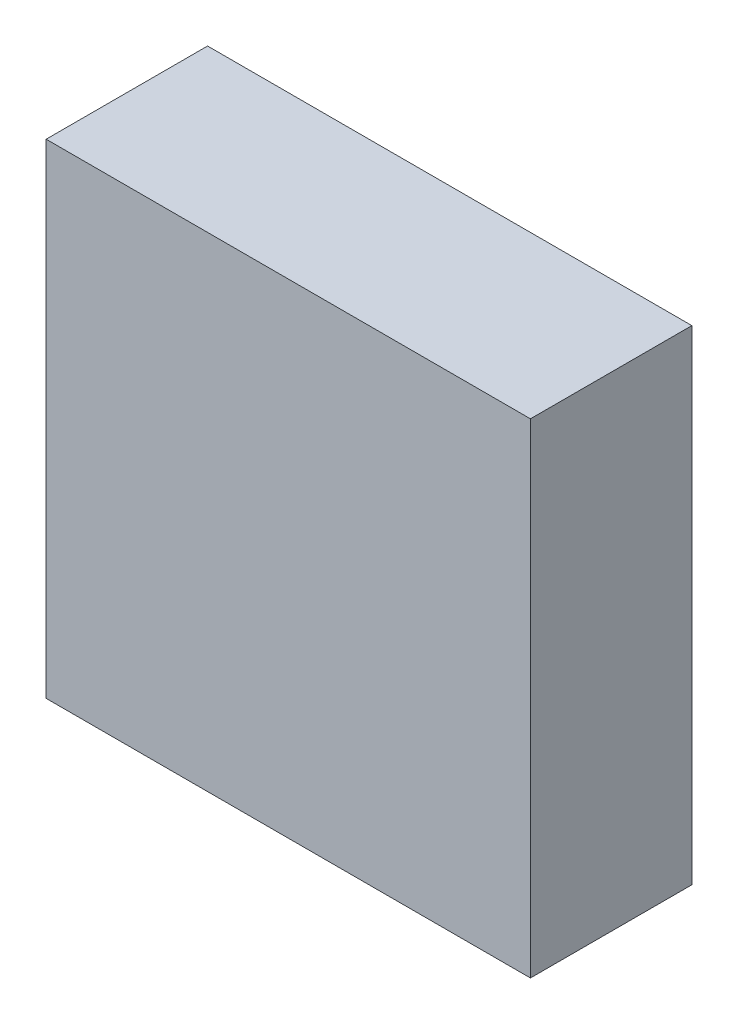
ISO-10303-21;
HEADER;
FILE_DESCRIPTION(('STEP AP214'),'2;1');
FILE_NAME('part.step','',(''),(''),'','','');
FILE_SCHEMA(('AUTOMOTIVE_DESIGN { 1 0 10303 214 1 1 1 1 }'));
ENDSEC;
DATA;
#1=APPLICATION_CONTEXT('core data for automotive mechanical design processes');
#2=APPLICATION_PROTOCOL_DEFINITION('international standard','automotive_design',2000,#1);
#3=PRODUCT_CONTEXT('',#1,'mechanical');
#4=PRODUCT('Part','Part','',(#3));
#5=PRODUCT_RELATED_PRODUCT_CATEGORY('part','',(#4));
#6=PRODUCT_DEFINITION_FORMATION('','',#4);
#7=PRODUCT_DEFINITION_CONTEXT('part definition',#1,'design');
#8=PRODUCT_DEFINITION('design','',#6,#7);
#9=PRODUCT_DEFINITION_SHAPE('','',#8);
#10=(LENGTH_UNIT() NAMED_UNIT(*) SI_UNIT(.MILLI.,.METRE.));
#11=(NAMED_UNIT(*) PLANE_ANGLE_UNIT() SI_UNIT($,.RADIAN.));
#12=(NAMED_UNIT(*) SI_UNIT($,.STERADIAN.) SOLID_ANGLE_UNIT());
#13=UNCERTAINTY_MEASURE_WITH_UNIT(LENGTH_MEASURE(1.E-05),#10,'distance_accuracy_value','');
#14=(GEOMETRIC_REPRESENTATION_CONTEXT(3) GLOBAL_UNCERTAINTY_ASSIGNED_CONTEXT((#13)) GLOBAL_UNIT_ASSIGNED_CONTEXT((#10,
#11,#12)) REPRESENTATION_CONTEXT('',''));
#15=CARTESIAN_POINT('',(0.,0.,0.));
#16=DIRECTION('',(0.,0.,1.));
#17=DIRECTION('',(1.,0.,0.));
#18=AXIS2_PLACEMENT_3D('',#15,#16,#17);
#19=CARTESIAN_POINT('',(30.,15.,5.));
#20=DIRECTION('',(0.,0.,-1.));
#21=DIRECTION('',(-1.,0.,0.));
#22=AXIS2_PLACEMENT_3D('',#19,#20,#21);
#23=PLANE('',#22);
#24=DIRECTION('',(0.,-1.,0.));
#25=VECTOR('',#24,1.);
#26=CARTESIAN_POINT('',(0.,15.,5.));
#27=LINE('',#26,#25);
#28=CARTESIAN_POINT('',(0.,15.,5.));
#29=VERTEX_POINT('',#28);
#30=CARTESIAN_POINT('',(0.,-15.,5.));
#31=VERTEX_POINT('',#30);
#32=EDGE_CURVE('E101',#29,#31,#27,.T.);
#33=ORIENTED_EDGE('',*,*,#32,.T.);
#34=DIRECTION('',(-1.,0.,0.));
#35=VECTOR('',#34,1.);
#36=CARTESIAN_POINT('',(30.,-15.,5.));
#37=LINE('',#36,#35);
#38=CARTESIAN_POINT('',(30.,-15.,5.));
#39=VERTEX_POINT('',#38);
#40=EDGE_CURVE('E43',#39,#31,#37,.T.);
#41=ORIENTED_EDGE('',*,*,#40,.F.);
#42=DIRECTION('',(0.,-1.,0.));
#43=VECTOR('',#42,1.);
#44=CARTESIAN_POINT('',(30.,15.,5.));
#45=LINE('',#44,#43);
#46=CARTESIAN_POINT('',(30.,15.,5.));
#47=VERTEX_POINT('',#46);
#48=EDGE_CURVE('E87',#47,#39,#45,.T.);
#49=ORIENTED_EDGE('',*,*,#48,.F.);
#50=DIRECTION('',(-1.,0.,0.));
#51=VECTOR('',#50,1.);
#52=CARTESIAN_POINT('',(30.,15.,5.));
#53=LINE('',#52,#51);
#54=EDGE_CURVE('E97',#47,#29,#53,.T.);
#55=ORIENTED_EDGE('',*,*,#54,.T.);
#56=EDGE_LOOP('',(#33,#41,#49,#55));
#57=FACE_BOUND('',#56,.T.);
#58=ADVANCED_FACE('F35',(#57),#23,.F.);
#59=CARTESIAN_POINT('',(30.,-15.,-5.));
#60=DIRECTION('',(0.,1.,0.));
#61=DIRECTION('',(0.,0.,1.));
#62=AXIS2_PLACEMENT_3D('',#59,#60,#61);
#63=PLANE('',#62);
#64=DIRECTION('',(0.,0.,-1.));
#65=VECTOR('',#64,1.);
#66=CARTESIAN_POINT('',(0.,-15.,-5.));
#67=LINE('',#66,#65);
#68=CARTESIAN_POINT('',(0.,-15.,-5.));
#69=VERTEX_POINT('',#68);
#70=EDGE_CURVE('E92',#31,#69,#67,.T.);
#71=ORIENTED_EDGE('',*,*,#70,.T.);
#72=DIRECTION('',(-1.,0.,0.));
#73=VECTOR('',#72,1.);
#74=CARTESIAN_POINT('',(30.,-15.,-5.));
#75=LINE('',#74,#73);
#76=CARTESIAN_POINT('',(30.,-15.,-5.));
#77=VERTEX_POINT('',#76);
#78=EDGE_CURVE('E90',#77,#69,#75,.T.);
#79=ORIENTED_EDGE('',*,*,#78,.F.);
#80=DIRECTION('',(0.,0.,-1.));
#81=VECTOR('',#80,1.);
#82=CARTESIAN_POINT('',(30.,-15.,-5.));
#83=LINE('',#82,#81);
#84=EDGE_CURVE('E82',#39,#77,#83,.T.);
#85=ORIENTED_EDGE('',*,*,#84,.F.);
#86=ORIENTED_EDGE('',*,*,#40,.T.);
#87=EDGE_LOOP('',(#71,#79,#85,#86));
#88=FACE_BOUND('',#87,.T.);
#89=ADVANCED_FACE('F91',(#88),#63,.F.);
#90=CARTESIAN_POINT('',(30.,15.,-5.));
#91=DIRECTION('',(0.,0.,1.));
#92=DIRECTION('',(1.,0.,0.));
#93=AXIS2_PLACEMENT_3D('',#90,#91,#92);
#94=PLANE('',#93);
#95=CARTESIAN_POINT('',(15.,-10.,-5.));
#96=DIRECTION('',(0.,0.,1.));
#97=DIRECTION('',(1.,0.,0.));
#98=AXIS2_PLACEMENT_3D('',#95,#96,#97);
#99=CIRCLE('',#98,3.);
#100=CARTESIAN_POINT('',(18.,-10.,-5.));
#101=VERTEX_POINT('',#100);
#102=EDGE_CURVE('E11',#101,#101,#99,.F.);
#103=ORIENTED_EDGE('',*,*,#102,.F.);
#104=EDGE_LOOP('',(#103));
#105=FACE_BOUND('',#104,.T.);
#106=DIRECTION('',(0.,1.,0.));
#107=VECTOR('',#106,1.);
#108=CARTESIAN_POINT('',(0.,15.,-5.));
#109=LINE('',#108,#107);
#110=CARTESIAN_POINT('',(0.,15.,-5.));
#111=VERTEX_POINT('',#110);
#112=EDGE_CURVE('E68',#69,#111,#109,.T.);
#113=ORIENTED_EDGE('',*,*,#112,.T.);
#114=DIRECTION('',(-1.,0.,0.));
#115=VECTOR('',#114,1.);
#116=CARTESIAN_POINT('',(30.,15.,-5.));
#117=LINE('',#116,#115);
#118=CARTESIAN_POINT('',(30.,15.,-5.));
#119=VERTEX_POINT('',#118);
#120=EDGE_CURVE('E93',#119,#111,#117,.T.);
#121=ORIENTED_EDGE('',*,*,#120,.F.);
#122=DIRECTION('',(0.,1.,0.));
#123=VECTOR('',#122,1.);
#124=CARTESIAN_POINT('',(30.,15.,-5.));
#125=LINE('',#124,#123);
#126=EDGE_CURVE('E85',#77,#119,#125,.T.);
#127=ORIENTED_EDGE('',*,*,#126,.F.);
#128=ORIENTED_EDGE('',*,*,#78,.T.);
#129=EDGE_LOOP('',(#113,#121,#127,#128));
#130=FACE_BOUND('',#129,.T.);
#131=ADVANCED_FACE('F95',(#105,#130),#94,.F.);
#132=CARTESIAN_POINT('',(30.,15.,-5.));
#133=DIRECTION('',(0.,-1.,0.));
#134=DIRECTION('',(0.,0.,-1.));
#135=AXIS2_PLACEMENT_3D('',#132,#133,#134);
#136=PLANE('',#135);
#137=DIRECTION('',(0.,0.,1.));
#138=VECTOR('',#137,1.);
#139=CARTESIAN_POINT('',(0.,15.,-5.));
#140=LINE('',#139,#138);
#141=EDGE_CURVE('E74',#111,#29,#140,.T.);
#142=ORIENTED_EDGE('',*,*,#141,.T.);
#143=ORIENTED_EDGE('',*,*,#54,.F.);
#144=DIRECTION('',(0.,0.,1.));
#145=VECTOR('',#144,1.);
#146=CARTESIAN_POINT('',(30.,15.,-5.));
#147=LINE('',#146,#145);
#148=EDGE_CURVE('E51',#119,#47,#147,.T.);
#149=ORIENTED_EDGE('',*,*,#148,.F.);
#150=ORIENTED_EDGE('',*,*,#120,.T.);
#151=EDGE_LOOP('',(#142,#143,#149,#150));
#152=FACE_BOUND('',#151,.T.);
#153=ADVANCED_FACE('F123',(#152),#136,.F.);
#154=CARTESIAN_POINT('',(30.,0.,0.));
#155=DIRECTION('',(-1.,0.,0.));
#156=DIRECTION('',(0.,0.,1.));
#157=AXIS2_PLACEMENT_3D('',#154,#155,#156);
#158=PLANE('',#157);
#159=ORIENTED_EDGE('',*,*,#48,.T.);
#160=ORIENTED_EDGE('',*,*,#84,.T.);
#161=ORIENTED_EDGE('',*,*,#126,.T.);
#162=ORIENTED_EDGE('',*,*,#148,.T.);
#163=EDGE_LOOP('',(#159,#160,#161,#162));
#164=FACE_BOUND('',#163,.T.);
#165=ADVANCED_FACE('F83',(#164),#158,.F.);
#166=CARTESIAN_POINT('',(0.,0.,0.));
#167=DIRECTION('',(-1.,0.,0.));
#168=DIRECTION('',(0.,0.,1.));
#169=AXIS2_PLACEMENT_3D('',#166,#167,#168);
#170=PLANE('',#169);
#171=ORIENTED_EDGE('',*,*,#32,.F.);
#172=ORIENTED_EDGE('',*,*,#141,.F.);
#173=ORIENTED_EDGE('',*,*,#112,.F.);
#174=ORIENTED_EDGE('',*,*,#70,.F.);
#175=EDGE_LOOP('',(#171,#172,#173,#174));
#176=FACE_BOUND('',#175,.T.);
#177=ADVANCED_FACE('F112',(#176),#170,.T.);
#178=CARTESIAN_POINT('',(15.,-10.,-15.));
#179=DIRECTION('',(0.,0.,1.));
#180=DIRECTION('',(1.,0.,0.));
#181=AXIS2_PLACEMENT_3D('',#178,#179,#180);
#182=CYLINDRICAL_SURFACE('',#181,3.);
#183=CARTESIAN_POINT('',(15.,-10.,-15.));
#184=DIRECTION('',(0.,0.,-1.));
#185=DIRECTION('',(-1.,0.,0.));
#186=AXIS2_PLACEMENT_3D('',#183,#184,#185);
#187=CIRCLE('',#186,3.);
#188=CARTESIAN_POINT('',(12.,-10.,-15.));
#189=VERTEX_POINT('',#188);
#190=EDGE_CURVE('E104',#189,#189,#187,.T.);
#191=ORIENTED_EDGE('',*,*,#190,.F.);
#192=EDGE_LOOP('',(#191));
#193=FACE_BOUND('',#192,.T.);
#194=ORIENTED_EDGE('',*,*,#102,.T.);
#195=EDGE_LOOP('',(#194));
#196=FACE_BOUND('',#195,.T.);
#197=ADVANCED_FACE('F114',(#193,#196),#182,.T.);
#198=CARTESIAN_POINT('',(15.,-10.,-15.));
#199=DIRECTION('',(0.,0.,-1.));
#200=DIRECTION('',(-1.,0.,0.));
#201=AXIS2_PLACEMENT_3D('',#198,#199,#200);
#202=PLANE('',#201);
#203=ORIENTED_EDGE('',*,*,#190,.T.);
#204=EDGE_LOOP('',(#203));
#205=FACE_BOUND('',#204,.T.);
#206=ADVANCED_FACE('F120',(#205),#202,.T.);
#207=CLOSED_SHELL('',(#58,#89,#131,#153,#165,#177,#197,#206));
#208=MANIFOLD_SOLID_BREP('B2',#207);
#209=ADVANCED_BREP_SHAPE_REPRESENTATION('',(#18,#208),#14);
#210=SHAPE_DEFINITION_REPRESENTATION(#9,#209);
ENDSEC;
END-ISO-10303-21;
